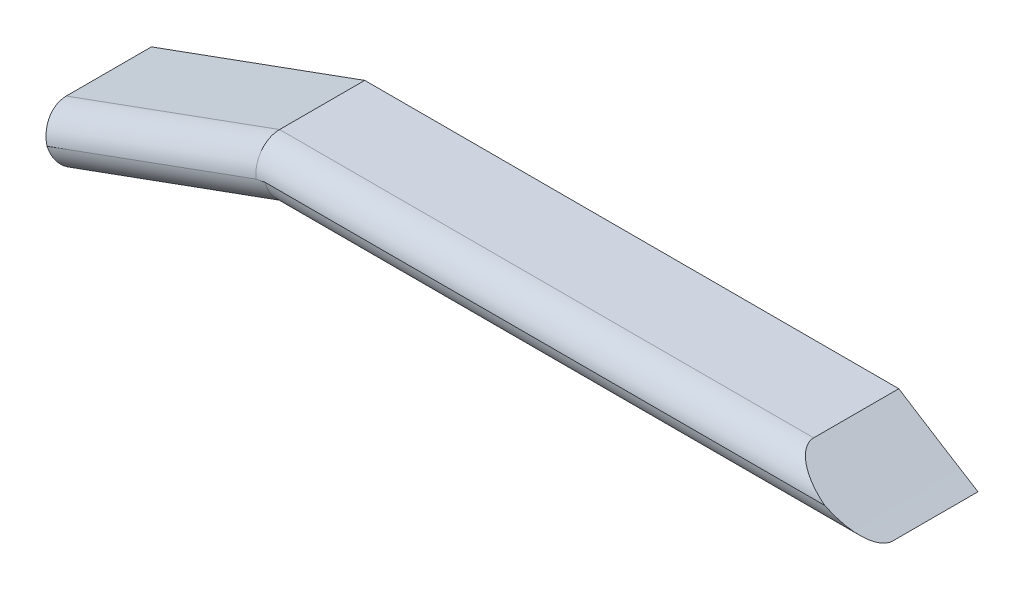
ISO-10303-21;
HEADER;
FILE_DESCRIPTION(('STEP AP214'),'2;1');
FILE_NAME('part.step','',(''),(''),'','','');
FILE_SCHEMA(('AUTOMOTIVE_DESIGN { 1 0 10303 214 1 1 1 1 }'));
ENDSEC;
DATA;
#1=APPLICATION_CONTEXT('core data for automotive mechanical design processes');
#2=APPLICATION_PROTOCOL_DEFINITION('international standard','automotive_design',2000,#1);
#3=PRODUCT_CONTEXT('',#1,'mechanical');
#4=PRODUCT('Part','Part','',(#3));
#5=PRODUCT_RELATED_PRODUCT_CATEGORY('part','',(#4));
#6=PRODUCT_DEFINITION_FORMATION('','',#4);
#7=PRODUCT_DEFINITION_CONTEXT('part definition',#1,'design');
#8=PRODUCT_DEFINITION('design','',#6,#7);
#9=PRODUCT_DEFINITION_SHAPE('','',#8);
#10=(LENGTH_UNIT() NAMED_UNIT(*) SI_UNIT(.MILLI.,.METRE.));
#11=(NAMED_UNIT(*) PLANE_ANGLE_UNIT() SI_UNIT($,.RADIAN.));
#12=(NAMED_UNIT(*) SI_UNIT($,.STERADIAN.) SOLID_ANGLE_UNIT());
#13=UNCERTAINTY_MEASURE_WITH_UNIT(LENGTH_MEASURE(1.E-05),#10,'distance_accuracy_value','');
#14=(GEOMETRIC_REPRESENTATION_CONTEXT(3) GLOBAL_UNCERTAINTY_ASSIGNED_CONTEXT((#13)) GLOBAL_UNIT_ASSIGNED_CONTEXT((#10,
#11,#12)) REPRESENTATION_CONTEXT('',''));
#15=CARTESIAN_POINT('',(0.,0.,0.));
#16=DIRECTION('',(0.,0.,1.));
#17=DIRECTION('',(1.,0.,0.));
#18=AXIS2_PLACEMENT_3D('',#15,#16,#17);
#19=CARTESIAN_POINT('',(0.,1.75,0.));
#20=DIRECTION('',(0.,0.,1.));
#21=DIRECTION('',(1.,0.,0.));
#22=AXIS2_PLACEMENT_3D('',#19,#20,#21);
#23=PLANE('',#22);
#24=DIRECTION('',(0.939692620785911,0.342020143325663,0.));
#25=VECTOR('',#24,1.);
#26=CARTESIAN_POINT('',(1.18119650068059,1.75,0.));
#27=LINE('',#26,#25);
#28=CARTESIAN_POINT('',(-6.33634446560669,-0.986161146605304,0.));
#29=VERTEX_POINT('',#28);
#30=CARTESIAN_POINT('',(1.18119650068059,1.75,0.));
#31=VERTEX_POINT('',#30);
#32=EDGE_CURVE('E84',#29,#31,#27,.T.);
#33=ORIENTED_EDGE('',*,*,#32,.T.);
#34=DIRECTION('',(-1.,0.,0.));
#35=VECTOR('',#34,1.);
#36=CARTESIAN_POINT('',(0.,1.75,0.));
#37=LINE('',#36,#35);
#38=CARTESIAN_POINT('',(20.,1.75,0.));
#39=VERTEX_POINT('',#38);
#40=EDGE_CURVE('E174',#39,#31,#37,.T.);
#41=ORIENTED_EDGE('',*,*,#40,.F.);
#42=CARTESIAN_POINT('',(135.362740762705,182.586080591559,0.));
#43=DIRECTION('',(0.,0.,1.));
#44=DIRECTION('',(1.,0.,0.));
#45=AXIS2_PLACEMENT_3D('',#42,#43,#44);
#46=CIRCLE('',#45,214.5);
#47=CARTESIAN_POINT('',(22.7902166983818,0.,0.));
#48=VERTEX_POINT('',#47);
#49=EDGE_CURVE('E133',#39,#48,#46,.T.);
#50=ORIENTED_EDGE('',*,*,#49,.T.);
#51=DIRECTION('',(-1.,0.,0.));
#52=VECTOR('',#51,1.);
#53=CARTESIAN_POINT('',(0.,0.,0.));
#54=LINE('',#53,#52);
#55=CARTESIAN_POINT('',(1.81814441064644,0.,0.));
#56=VERTEX_POINT('',#55);
#57=EDGE_CURVE('E131',#48,#56,#54,.T.);
#58=ORIENTED_EDGE('',*,*,#57,.T.);
#59=DIRECTION('',(-0.93969262078591,-0.342020143325663,0.));
#60=VECTOR('',#59,1.);
#61=CARTESIAN_POINT('',(-5.69939655564085,-2.73616114660531,0.));
#62=LINE('',#61,#60);
#63=CARTESIAN_POINT('',(-5.69939655564085,-2.73616114660531,0.));
#64=VERTEX_POINT('',#63);
#65=EDGE_CURVE('E163',#56,#64,#62,.T.);
#66=ORIENTED_EDGE('',*,*,#65,.T.);
#67=DIRECTION('',(-0.342020143325662,0.939692620785911,0.));
#68=VECTOR('',#67,1.);
#69=CARTESIAN_POINT('',(-6.33634446560669,-0.986161146605304,0.));
#70=LINE('',#69,#68);
#71=EDGE_CURVE('E156',#64,#29,#70,.T.);
#72=ORIENTED_EDGE('',*,*,#71,.T.);
#73=EDGE_LOOP('',(#33,#41,#50,#58,#66,#72));
#74=FACE_BOUND('',#73,.T.);
#75=ADVANCED_FACE('F39',(#74),#23,.F.);
#76=CARTESIAN_POINT('',(0.,1.75,0.));
#77=DIRECTION('',(0.,-1.,0.));
#78=DIRECTION('',(0.,0.,-1.));
#79=AXIS2_PLACEMENT_3D('',#76,#77,#78);
#80=PLANE('',#79);
#81=DIRECTION('',(0.,0.,1.));
#82=VECTOR('',#81,1.);
#83=CARTESIAN_POINT('',(1.18119650068059,1.75,0.));
#84=LINE('',#83,#82);
#85=CARTESIAN_POINT('',(1.18119650068059,1.75,3.));
#86=VERTEX_POINT('',#85);
#87=EDGE_CURVE('E155',#31,#86,#84,.T.);
#88=ORIENTED_EDGE('',*,*,#87,.T.);
#89=DIRECTION('',(1.,0.,0.));
#90=VECTOR('',#89,1.);
#91=CARTESIAN_POINT('',(0.,1.75,3.));
#92=LINE('',#91,#90);
#93=CARTESIAN_POINT('',(20.,1.75,3.));
#94=VERTEX_POINT('',#93);
#95=EDGE_CURVE('E11',#86,#94,#92,.T.);
#96=ORIENTED_EDGE('',*,*,#95,.T.);
#97=DIRECTION('',(0.,0.,-1.));
#98=VECTOR('',#97,1.);
#99=CARTESIAN_POINT('',(20.,1.75,4.));
#100=LINE('',#99,#98);
#101=EDGE_CURVE('E172',#94,#39,#100,.T.);
#102=ORIENTED_EDGE('',*,*,#101,.T.);
#103=ORIENTED_EDGE('',*,*,#40,.T.);
#104=EDGE_LOOP('',(#88,#96,#102,#103));
#105=FACE_BOUND('',#104,.T.);
#106=ADVANCED_FACE('F202',(#105),#80,.F.);
#107=CARTESIAN_POINT('',(0.,0.,0.));
#108=DIRECTION('',(0.,-1.,0.));
#109=DIRECTION('',(0.,0.,-1.));
#110=AXIS2_PLACEMENT_3D('',#107,#108,#109);
#111=PLANE('',#110);
#112=DIRECTION('',(0.,0.,1.));
#113=VECTOR('',#112,1.);
#114=CARTESIAN_POINT('',(22.7902166983818,0.,-3.29360125454324));
#115=LINE('',#114,#113);
#116=CARTESIAN_POINT('',(22.7902166983818,0.,3.));
#117=VERTEX_POINT('',#116);
#118=EDGE_CURVE('E120',#48,#117,#115,.T.);
#119=ORIENTED_EDGE('',*,*,#118,.T.);
#120=DIRECTION('',(1.,0.,0.));
#121=VECTOR('',#120,1.);
#122=CARTESIAN_POINT('',(1.81814441064644,0.,3.));
#123=LINE('',#122,#121);
#124=CARTESIAN_POINT('',(1.81814441064644,0.,3.));
#125=VERTEX_POINT('',#124);
#126=EDGE_CURVE('E125',#117,#125,#123,.F.);
#127=ORIENTED_EDGE('',*,*,#126,.T.);
#128=DIRECTION('',(0.,0.,-1.));
#129=VECTOR('',#128,1.);
#130=CARTESIAN_POINT('',(1.81814441064644,0.,13.3070581101789));
#131=LINE('',#130,#129);
#132=EDGE_CURVE('E168',#125,#56,#131,.T.);
#133=ORIENTED_EDGE('',*,*,#132,.T.);
#134=ORIENTED_EDGE('',*,*,#57,.F.);
#135=EDGE_LOOP('',(#119,#127,#133,#134));
#136=FACE_BOUND('',#135,.T.);
#137=ADVANCED_FACE('F128',(#136),#111,.T.);
#138=CARTESIAN_POINT('',(135.362740762705,182.586080591559,-3.29360125454324));
#139=DIRECTION('',(0.,0.,1.));
#140=DIRECTION('',(1.,0.,0.));
#141=AXIS2_PLACEMENT_3D('',#138,#139,#140);
#142=CYLINDRICAL_SURFACE('',#141,214.5);
#143=CARTESIAN_POINT('',(20.,1.75,3.));
#144=CARTESIAN_POINT('',(19.9999359697225,1.75004108147473,3.03233341576407));
#145=CARTESIAN_POINT('',(20.0024547988936,1.74843397509542,3.06457242856372));
#146=CARTESIAN_POINT('',(20.0120754874317,1.74229697115923,3.12775762099164));
#147=CARTESIAN_POINT('',(20.0191317084118,1.73779617919479,3.15871344267938));
#148=CARTESIAN_POINT('',(20.0392592941003,1.72496043809444,3.22551998857361));
#149=CARTESIAN_POINT('',(20.0533124551234,1.71599982176311,3.26094937216629));
#150=CARTESIAN_POINT('',(20.0861028168724,1.69509926400918,3.32871181852899));
#151=CARTESIAN_POINT('',(20.1048587797764,1.68314738909775,3.36103174354154));
#152=CARTESIAN_POINT('',(20.1560542376534,1.65053767669582,3.43764063130862));
#153=CARTESIAN_POINT('',(20.1906583012366,1.62850727968463,3.47988168323141));
#154=CARTESIAN_POINT('',(20.2648239480232,1.58132515442276,3.55765051682241));
#155=CARTESIAN_POINT('',(20.3043944396007,1.55616781812698,3.59316593997752));
#156=CARTESIAN_POINT('',(20.3814020755234,1.50724815182407,3.65413568271514));
#157=CARTESIAN_POINT('',(20.4184446596795,1.48373162024043,3.68029804910685));
#158=CARTESIAN_POINT('',(20.4943097526539,1.43560285635891,3.72877598826734));
#159=CARTESIAN_POINT('',(20.5331335663337,1.4109898211993,3.75108868205739));
#160=CARTESIAN_POINT('',(20.6518464892651,1.33578544293838,3.8130834487882));
#161=CARTESIAN_POINT('',(20.7336951938367,1.28400796012977,3.84761257123901));
#162=CARTESIAN_POINT('',(20.8794249656274,1.19196294861631,3.89815695591306));
#163=CARTESIAN_POINT('',(20.9427160731474,1.15203293306095,3.91664069568242));
#164=CARTESIAN_POINT('',(21.0704013832381,1.07157194772303,3.94786888621358));
#165=CARTESIAN_POINT('',(21.1347963727295,1.03104055226127,3.96060904955666));
#166=CARTESIAN_POINT('',(21.2630202540062,0.950430436370239,3.98057259574752));
#167=CARTESIAN_POINT('',(21.3268377645166,0.910357106670936,3.9878931625847));
#168=CARTESIAN_POINT('',(21.4546779349371,0.83017578377449,3.99759014909431));
#169=CARTESIAN_POINT('',(21.5187000674023,0.790067962995087,3.99997488560868));
#170=CARTESIAN_POINT('',(21.5827346320145,0.749999999999993,4.));
#171=B_SPLINE_CURVE_WITH_KNOTS('',3,(#143,#144,#145,#146,#147,#148,#149,#150,#151,#152,#153,
#154,#155,#156,#157,#158,#159,#160,#161,#162,#163,#164,#165,#166,#167,#168,#169,#170),
.UNSPECIFIED.,.F.,.F.,(4,2,2,2,2,2,2,2,2,2,2,2,2,4),(0.,0.0967095022846053,0.192461173076483,
0.309277743940681,0.42656799254497,0.602228282378154,0.778208285244818,0.931242952936106,
1.08439157618881,1.39185941959917,1.62291370780405,1.85414018712412,2.08111262425115,
2.30770230191402),.UNSPECIFIED.);
#172=CARTESIAN_POINT('',(21.3832110643954,0.875000000000017,3.99215674164922));
#173=VERTEX_POINT('',#172);
#174=EDGE_CURVE('E123',#94,#173,#171,.T.);
#175=ORIENTED_EDGE('',*,*,#174,.T.);
#176=CARTESIAN_POINT('',(21.1841730041465,1.,4.));
#177=CARTESIAN_POINT('',(21.2555579658697,0.955113741486788,3.99996075276532));
#178=CARTESIAN_POINT('',(21.326986605312,0.910259699893455,3.99697502399293));
#179=CARTESIAN_POINT('',(21.469704519169,0.820755620268474,3.98485427593647));
#180=CARTESIAN_POINT('',(21.5409929521072,0.77610641266542,3.97570333352035));
#181=CARTESIAN_POINT('',(21.6831073620129,0.687213047910261,3.95094504974473));
#182=CARTESIAN_POINT('',(21.7539304297504,0.642971165360256,3.93531253394293));
#183=CARTESIAN_POINT('',(21.8941865058277,0.55546776438129,3.89703564352075));
#184=CARTESIAN_POINT('',(21.9636211710209,0.512205068153029,3.87440023244769));
#185=CARTESIAN_POINT('',(22.0843452886221,0.437078588497022,3.82740288664568));
#186=CARTESIAN_POINT('',(22.1360833518952,0.404913518167188,3.80468043381692));
#187=CARTESIAN_POINT('',(22.2377186986965,0.341785877597576,3.75392073269233));
#188=CARTESIAN_POINT('',(22.2876155327154,0.310823600906231,3.72588219667426));
#189=CARTESIAN_POINT('',(22.3849791941852,0.250459562593007,3.66339604382804));
#190=CARTESIAN_POINT('',(22.4324246829509,0.221071442000865,3.62890135889537));
#191=CARTESIAN_POINT('',(22.522808099918,0.165132249805895,3.55247981834987));
#192=CARTESIAN_POINT('',(22.5657568334193,0.138574374500101,3.51057146142267));
#193=CARTESIAN_POINT('',(22.627891304254,0.100178524587476,3.43731543985028));
#194=CARTESIAN_POINT('',(22.6495189592041,0.0868198202405714,3.40884922289603));
#195=CARTESIAN_POINT('',(22.689376087036,0.0622097187785881,3.34871816828247));
#196=CARTESIAN_POINT('',(22.7076043546318,0.050959069088239,3.31705220223319));
#197=CARTESIAN_POINT('',(22.7396891820011,0.0311611424664193,3.25016673125587));
#198=CARTESIAN_POINT('',(22.7534831770167,0.0226525503596868,3.2149049001522));
#199=CARTESIAN_POINT('',(22.774912693082,0.00943604101814448,3.14192110752576));
#200=CARTESIAN_POINT('',(22.7825724625354,0.00471315892058269,3.1042094760296));
#201=CARTESIAN_POINT('',(22.787853526844,0.00145702111201613,3.05508756941326));
#202=CARTESIAN_POINT('',(22.7887382307554,0.000911549594277031,3.0440969074591));
#203=CARTESIAN_POINT('',(22.7899193005752,0.000183357191903035,3.0220727870368));
#204=CARTESIAN_POINT('',(22.7902157056783,6.12141041532743E-07,3.01103933146882));
#205=CARTESIAN_POINT('',(22.7902166983818,0.,3.));
#206=B_SPLINE_CURVE_WITH_KNOTS('',3,(#176,#177,#178,#179,#180,#181,#182,#183,#184,#185,#186,
#187,#188,#189,#190,#191,#192,#193,#194,#195,#196,#197,#198,#199,#200,#201,#202,#203,#204,#205),
.UNSPECIFIED.,.F.,.F.,(4,2,2,2,2,2,2,2,2,2,2,2,2,2,4),(0.,0.25295321562898,0.506562260457024,
0.761165690097138,1.01544457204324,1.210303754038,1.40521019748731,1.6015972326406,
1.79750098007606,1.91173010301496,2.02599965032302,2.14181711226636,2.25717445974948,
2.29027758557328,2.323378505866),.UNSPECIFIED.);
#207=EDGE_CURVE('E116',#173,#117,#206,.T.);
#208=ORIENTED_EDGE('',*,*,#207,.T.);
#209=ORIENTED_EDGE('',*,*,#118,.F.);
#210=ORIENTED_EDGE('',*,*,#49,.F.);
#211=ORIENTED_EDGE('',*,*,#101,.F.);
#212=EDGE_LOOP('',(#175,#208,#209,#210,#211));
#213=FACE_BOUND('',#212,.T.);
#214=ADVANCED_FACE('F118',(#213),#142,.F.);
#215=CARTESIAN_POINT('',(1.18119650068059,1.75,13.3070581101789));
#216=DIRECTION('',(-0.342020143325663,0.93969262078591,0.));
#217=DIRECTION('',(-0.939692620785911,-0.342020143325663,0.));
#218=AXIS2_PLACEMENT_3D('',#215,#216,#217);
#219=PLANE('',#218);
#220=DIRECTION('',(0.,0.,-1.));
#221=VECTOR('',#220,1.);
#222=CARTESIAN_POINT('',(-6.33634446560669,-0.986161146605304,13.3070581101789));
#223=LINE('',#222,#221);
#224=CARTESIAN_POINT('',(-6.33634446560669,-0.986161146605304,3.));
#225=VERTEX_POINT('',#224);
#226=EDGE_CURVE('E166',#225,#29,#223,.T.);
#227=ORIENTED_EDGE('',*,*,#226,.F.);
#228=DIRECTION('',(-0.939692620785911,-0.342020143325663,0.));
#229=VECTOR('',#228,1.);
#230=CARTESIAN_POINT('',(1.18119650068059,1.75,3.));
#231=LINE('',#230,#229);
#232=EDGE_CURVE('E49',#225,#86,#231,.F.);
#233=ORIENTED_EDGE('',*,*,#232,.T.);
#234=ORIENTED_EDGE('',*,*,#87,.F.);
#235=ORIENTED_EDGE('',*,*,#32,.F.);
#236=EDGE_LOOP('',(#227,#233,#234,#235));
#237=FACE_BOUND('',#236,.T.);
#238=ADVANCED_FACE('F219',(#237),#219,.T.);
#239=CARTESIAN_POINT('',(-6.33634446560669,-0.986161146605304,13.3070581101789));
#240=DIRECTION('',(-0.939692620785911,-0.342020143325662,0.));
#241=DIRECTION('',(0.342020143325662,-0.939692620785911,0.));
#242=AXIS2_PLACEMENT_3D('',#239,#240,#241);
#243=PLANE('',#242);
#244=DIRECTION('',(0.,0.,-1.));
#245=VECTOR('',#244,1.);
#246=CARTESIAN_POINT('',(-5.69939655564085,-2.73616114660531,13.3070581101789));
#247=LINE('',#246,#245);
#248=CARTESIAN_POINT('',(-5.69939655564085,-2.73616114660531,3.));
#249=VERTEX_POINT('',#248);
#250=EDGE_CURVE('E134',#249,#64,#247,.T.);
#251=ORIENTED_EDGE('',*,*,#250,.F.);
#252=CARTESIAN_POINT('',(-6.04141669896651,-1.7964685258194,3.));
#253=DIRECTION('',(-0.939692620785911,-0.342020143325662,0.));
#254=DIRECTION('',(0.342020143325662,-0.939692620785911,0.));
#255=AXIS2_PLACEMENT_3D('',#252,#253,#254);
#256=CIRCLE('',#255,1.);
#257=CARTESIAN_POINT('',(-6.01787051062377,-1.86116114660531,3.99762740631479));
#258=VERTEX_POINT('',#257);
#259=EDGE_CURVE('E182',#249,#258,#256,.T.);
#260=ORIENTED_EDGE('',*,*,#259,.T.);
#261=CARTESIAN_POINT('',(-5.99432432228102,-1.92585376739121,3.));
#262=DIRECTION('',(-0.939692620785911,-0.342020143325662,0.));
#263=DIRECTION('',(0.342020143325662,-0.939692620785911,0.));
#264=AXIS2_PLACEMENT_3D('',#261,#262,#263);
#265=CIRCLE('',#264,1.);
#266=EDGE_CURVE('E180',#258,#225,#265,.T.);
#267=ORIENTED_EDGE('',*,*,#266,.T.);
#268=ORIENTED_EDGE('',*,*,#226,.T.);
#269=ORIENTED_EDGE('',*,*,#71,.F.);
#270=EDGE_LOOP('',(#251,#260,#267,#268,#269));
#271=FACE_BOUND('',#270,.T.);
#272=ADVANCED_FACE('F225',(#271),#243,.T.);
#273=CARTESIAN_POINT('',(-5.69939655564085,-2.73616114660531,13.3070581101789));
#274=DIRECTION('',(0.342020143325663,-0.93969262078591,0.));
#275=DIRECTION('',(0.93969262078591,0.342020143325663,0.));
#276=AXIS2_PLACEMENT_3D('',#273,#274,#275);
#277=PLANE('',#276);
#278=ORIENTED_EDGE('',*,*,#132,.F.);
#279=DIRECTION('',(0.93969262078591,0.342020143325663,0.));
#280=VECTOR('',#279,1.);
#281=CARTESIAN_POINT('',(-5.69939655564085,-2.73616114660531,3.));
#282=LINE('',#281,#280);
#283=EDGE_CURVE('E176',#125,#249,#282,.F.);
#284=ORIENTED_EDGE('',*,*,#283,.T.);
#285=ORIENTED_EDGE('',*,*,#250,.T.);
#286=ORIENTED_EDGE('',*,*,#65,.F.);
#287=EDGE_LOOP('',(#278,#284,#285,#286));
#288=FACE_BOUND('',#287,.T.);
#289=ADVANCED_FACE('F232',(#288),#277,.T.);
#290=CARTESIAN_POINT('',(0.480193885876977,0.430678141592802,3.));
#291=DIRECTION('',(0.939692620785911,0.342020143325663,0.));
#292=DIRECTION('',(-0.342020143325663,0.93969262078591,0.));
#293=AXIS2_PLACEMENT_3D('',#290,#291,#292);
#294=CYLINDRICAL_SURFACE('',#293,1.);
#295=CARTESIAN_POINT('',(1.35752348138906,0.75,3.));
#296=DIRECTION('',(0.984807753012208,0.173648177666927,0.));
#297=DIRECTION('',(0.173648177666927,-0.984807753012209,0.));
#298=AXIS2_PLACEMENT_3D('',#295,#296,#297);
#299=ELLIPSE('',#298,1.01542661188574,1.);
#300=CARTESIAN_POINT('',(1.34538434754361,0.818844449083579,3.99762740631479));
#301=VERTEX_POINT('',#300);
#302=EDGE_CURVE('E43',#86,#301,#299,.T.);
#303=ORIENTED_EDGE('',*,*,#302,.F.);
#304=ORIENTED_EDGE('',*,*,#232,.F.);
#305=ORIENTED_EDGE('',*,*,#266,.F.);
#306=DIRECTION('',(0.939692620785911,0.342020143325663,0.));
#307=VECTOR('',#306,1.);
#308=CARTESIAN_POINT('',(-2.23654740458126,-0.484872089862837,3.99762740631479));
#309=LINE('',#308,#307);
#310=EDGE_CURVE('E153',#301,#258,#309,.F.);
#311=ORIENTED_EDGE('',*,*,#310,.F.);
#312=EDGE_LOOP('',(#303,#304,#305,#311));
#313=FACE_BOUND('',#312,.T.);
#314=ADVANCED_FACE('F41',(#313),#294,.T.);
#315=CARTESIAN_POINT('',(0.,0.75,3.));
#316=DIRECTION('',(1.,0.,0.));
#317=DIRECTION('',(0.,0.,-1.));
#318=AXIS2_PLACEMENT_3D('',#315,#316,#317);
#319=CYLINDRICAL_SURFACE('',#318,1.);
#320=DIRECTION('',(1.,0.,0.));
#321=VECTOR('',#320,1.);
#322=CARTESIAN_POINT('',(11.3819655663476,0.875,3.99215674164922));
#323=LINE('',#322,#321);
#324=CARTESIAN_POINT('',(1.66385830252653,0.875,3.99215674164922));
#325=VERTEX_POINT('',#324);
#326=EDGE_CURVE('E69',#173,#325,#323,.F.);
#327=ORIENTED_EDGE('',*,*,#326,.F.);
#328=ORIENTED_EDGE('',*,*,#174,.F.);
#329=ORIENTED_EDGE('',*,*,#95,.F.);
#330=ORIENTED_EDGE('',*,*,#302,.T.);
#331=CARTESIAN_POINT('',(0.954948075074307,0.75,3.));
#332=DIRECTION('',(0.173648177666927,-0.984807753012209,0.));
#333=DIRECTION('',(-0.984807753012209,-0.173648177666928,0.));
#334=AXIS2_PLACEMENT_3D('',#331,#332,#333);
#335=ELLIPSE('',#334,5.75877048314373,1.);
#336=EDGE_CURVE('E150',#325,#301,#335,.T.);
#337=ORIENTED_EDGE('',*,*,#336,.F.);
#338=EDGE_LOOP('',(#327,#328,#329,#330,#337));
#339=FACE_BOUND('',#338,.T.);
#340=ADVANCED_FACE('F190',(#339),#319,.T.);
#341=CARTESIAN_POINT('',(0.,1.,3.));
#342=DIRECTION('',(-1.,0.,0.));
#343=DIRECTION('',(0.,0.,1.));
#344=AXIS2_PLACEMENT_3D('',#341,#342,#343);
#345=CYLINDRICAL_SURFACE('',#344,1.);
#346=ORIENTED_EDGE('',*,*,#207,.F.);
#347=ORIENTED_EDGE('',*,*,#326,.T.);
#348=CARTESIAN_POINT('',(1.64181742993797,1.,3.));
#349=DIRECTION('',(-0.984807753012209,-0.173648177666928,0.));
#350=DIRECTION('',(0.173648177666927,-0.984807753012209,0.));
#351=AXIS2_PLACEMENT_3D('',#348,#349,#350);
#352=ELLIPSE('',#351,1.01542661188574,1.);
#353=EDGE_CURVE('E138',#125,#325,#352,.T.);
#354=ORIENTED_EDGE('',*,*,#353,.F.);
#355=ORIENTED_EDGE('',*,*,#126,.F.);
#356=EDGE_LOOP('',(#346,#347,#354,#355));
#357=FACE_BOUND('',#356,.T.);
#358=ADVANCED_FACE('F136',(#357),#345,.T.);
#359=CARTESIAN_POINT('',(0.433101509191493,0.560063383164623,3.));
#360=DIRECTION('',(-0.93969262078591,-0.342020143325663,0.));
#361=DIRECTION('',(0.342020143325663,-0.93969262078591,0.));
#362=AXIS2_PLACEMENT_3D('',#359,#360,#361);
#363=CYLINDRICAL_SURFACE('',#362,1.);
#364=ORIENTED_EDGE('',*,*,#259,.F.);
#365=ORIENTED_EDGE('',*,*,#283,.F.);
#366=ORIENTED_EDGE('',*,*,#353,.T.);
#367=ORIENTED_EDGE('',*,*,#336,.T.);
#368=ORIENTED_EDGE('',*,*,#310,.T.);
#369=EDGE_LOOP('',(#364,#365,#366,#367,#368));
#370=FACE_BOUND('',#369,.T.);
#371=ADVANCED_FACE('F196',(#370),#363,.T.);
#372=CLOSED_SHELL('',(#75,#106,#137,#214,#238,#272,#289,#314,#340,#358,#371));
#373=MANIFOLD_SOLID_BREP('B2',#372);
#374=ADVANCED_BREP_SHAPE_REPRESENTATION('',(#18,#373),#14);
#375=SHAPE_DEFINITION_REPRESENTATION(#9,#374);
ENDSEC;
END-ISO-10303-21;
